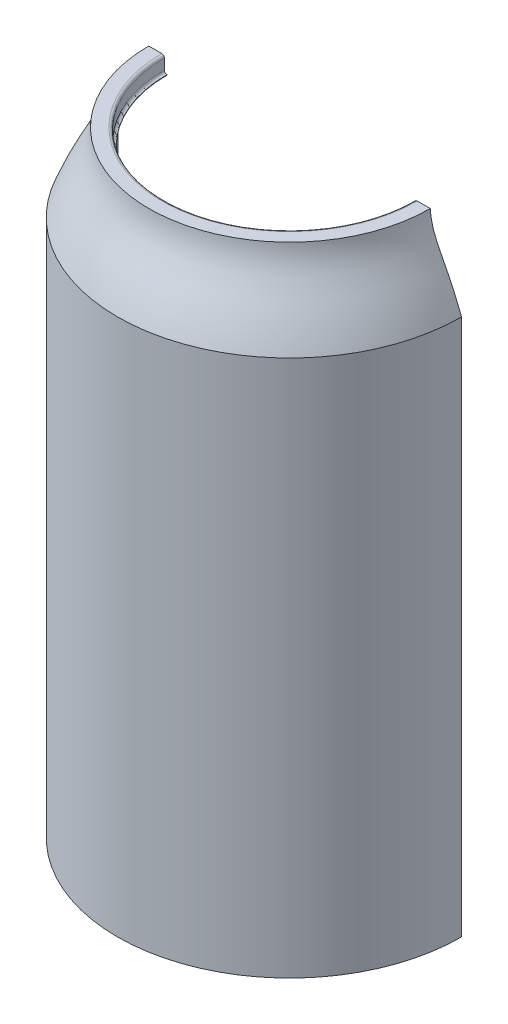
ISO-10303-21;
HEADER;
FILE_DESCRIPTION(('STEP AP214'),'2;1');
FILE_NAME('part.step','',(''),(''),'','','');
FILE_SCHEMA(('AUTOMOTIVE_DESIGN { 1 0 10303 214 1 1 1 1 }'));
ENDSEC;
DATA;
#1=APPLICATION_CONTEXT('core data for automotive mechanical design processes');
#2=APPLICATION_PROTOCOL_DEFINITION('international standard','automotive_design',2000,#1);
#3=PRODUCT_CONTEXT('',#1,'mechanical');
#4=PRODUCT('Part','Part','',(#3));
#5=PRODUCT_RELATED_PRODUCT_CATEGORY('part','',(#4));
#6=PRODUCT_DEFINITION_FORMATION('','',#4);
#7=PRODUCT_DEFINITION_CONTEXT('part definition',#1,'design');
#8=PRODUCT_DEFINITION('design','',#6,#7);
#9=PRODUCT_DEFINITION_SHAPE('','',#8);
#10=(LENGTH_UNIT() NAMED_UNIT(*) SI_UNIT(.MILLI.,.METRE.));
#11=(NAMED_UNIT(*) PLANE_ANGLE_UNIT() SI_UNIT($,.RADIAN.));
#12=(NAMED_UNIT(*) SI_UNIT($,.STERADIAN.) SOLID_ANGLE_UNIT());
#13=UNCERTAINTY_MEASURE_WITH_UNIT(LENGTH_MEASURE(1.E-05),#10,'distance_accuracy_value','');
#14=(GEOMETRIC_REPRESENTATION_CONTEXT(3) GLOBAL_UNCERTAINTY_ASSIGNED_CONTEXT((#13)) GLOBAL_UNIT_ASSIGNED_CONTEXT((#10,
#11,#12)) REPRESENTATION_CONTEXT('',''));
#15=CARTESIAN_POINT('',(0.,0.,0.));
#16=DIRECTION('',(0.,0.,1.));
#17=DIRECTION('',(1.,0.,0.));
#18=AXIS2_PLACEMENT_3D('',#15,#16,#17);
#19=CARTESIAN_POINT('',(33.,-51.5,0.));
#20=CARTESIAN_POINT('',(27.2132128879075,-53.4506224738682,0.));
#21=CARTESIAN_POINT('',(25.5,-56.5,0.));
#22=B_SPLINE_CURVE_WITH_KNOTS('',2,(#19,#20,#21),.UNSPECIFIED.,.F.,.F.,(3,3),(0.,
0.724920870834953),.UNSPECIFIED.);
#23=CARTESIAN_POINT('',(0.,66.5,0.));
#24=DIRECTION('',(0.,1.,0.));
#25=AXIS1_PLACEMENT('',#23,#24);
#26=SURFACE_OF_REVOLUTION('',#22,#25);
#27=CARTESIAN_POINT('',(33.,-51.5,0.));
#28=CARTESIAN_POINT('',(27.2132128879075,-53.4506224738682,0.));
#29=CARTESIAN_POINT('',(25.5,-56.5,0.));
#30=B_SPLINE_CURVE_WITH_KNOTS('',2,(#27,#28,#29),.UNSPECIFIED.,.F.,.F.,(3,3),(0.,
0.724920870834953),.UNSPECIFIED.);
#31=CARTESIAN_POINT('',(33.,-51.5,0.));
#32=VERTEX_POINT('',#31);
#33=CARTESIAN_POINT('',(25.5,-56.5,0.));
#34=VERTEX_POINT('',#33);
#35=EDGE_CURVE('E344',#32,#34,#30,.T.);
#36=ORIENTED_EDGE('',*,*,#35,.F.);
#37=CARTESIAN_POINT('',(0.,-51.5,0.));
#38=DIRECTION('',(0.,1.,0.));
#39=DIRECTION('',(-1.,0.,0.));
#40=AXIS2_PLACEMENT_3D('',#37,#38,#39);
#41=CIRCLE('',#40,33.);
#42=CARTESIAN_POINT('',(-33.,-51.5,0.));
#43=VERTEX_POINT('',#42);
#44=EDGE_CURVE('E171',#43,#32,#41,.T.);
#45=ORIENTED_EDGE('',*,*,#44,.F.);
#46=CARTESIAN_POINT('',(-33.,-51.5,0.));
#47=CARTESIAN_POINT('',(-27.2132128879075,-53.4506224738682,0.));
#48=CARTESIAN_POINT('',(-25.5,-56.5,0.));
#49=B_SPLINE_CURVE_WITH_KNOTS('',2,(#46,#47,#48),.UNSPECIFIED.,.F.,.F.,(3,3),(0.,
0.724920870834953),.UNSPECIFIED.);
#50=CARTESIAN_POINT('',(-25.5,-56.5,0.));
#51=VERTEX_POINT('',#50);
#52=EDGE_CURVE('E192',#51,#43,#49,.F.);
#53=ORIENTED_EDGE('',*,*,#52,.F.);
#54=CARTESIAN_POINT('',(0.,-56.5,0.));
#55=DIRECTION('',(0.,1.,0.));
#56=DIRECTION('',(-1.,0.,0.));
#57=AXIS2_PLACEMENT_3D('',#54,#55,#56);
#58=CIRCLE('',#57,25.5);
#59=EDGE_CURVE('E224',#51,#34,#58,.T.);
#60=ORIENTED_EDGE('',*,*,#59,.T.);
#61=EDGE_LOOP('',(#36,#45,#53,#60));
#62=FACE_BOUND('',#61,.T.);
#63=ADVANCED_FACE('F41',(#62),#26,.F.);
#64=CARTESIAN_POINT('',(0.,66.5,0.));
#65=DIRECTION('',(0.,1.,0.));
#66=DIRECTION('',(-1.,0.,0.));
#67=AXIS2_PLACEMENT_3D('',#64,#65,#66);
#68=CYLINDRICAL_SURFACE('',#67,33.);
#69=ORIENTED_EDGE('',*,*,#44,.T.);
#70=DIRECTION('',(0.,1.,0.));
#71=VECTOR('',#70,1.);
#72=CARTESIAN_POINT('',(33.,66.5,0.));
#73=LINE('',#72,#71);
#74=CARTESIAN_POINT('',(33.,51.5,0.));
#75=VERTEX_POINT('',#74);
#76=EDGE_CURVE('E340',#32,#75,#73,.T.);
#77=ORIENTED_EDGE('',*,*,#76,.T.);
#78=CARTESIAN_POINT('',(0.,51.5,0.));
#79=DIRECTION('',(0.,1.,0.));
#80=DIRECTION('',(-1.,0.,0.));
#81=AXIS2_PLACEMENT_3D('',#78,#79,#80);
#82=CIRCLE('',#81,33.);
#83=CARTESIAN_POINT('',(-33.,51.5,0.));
#84=VERTEX_POINT('',#83);
#85=EDGE_CURVE('E409',#84,#75,#82,.T.);
#86=ORIENTED_EDGE('',*,*,#85,.F.);
#87=DIRECTION('',(0.,1.,0.));
#88=VECTOR('',#87,1.);
#89=CARTESIAN_POINT('',(-33.,66.5,0.));
#90=LINE('',#89,#88);
#91=EDGE_CURVE('E377',#84,#43,#90,.F.);
#92=ORIENTED_EDGE('',*,*,#91,.T.);
#93=EDGE_LOOP('',(#69,#77,#86,#92));
#94=FACE_BOUND('',#93,.T.);
#95=ADVANCED_FACE('F43',(#94),#68,.T.);
#96=CARTESIAN_POINT('',(33.,51.5,0.));
#97=CARTESIAN_POINT('',(29.8692891987023,59.7715027618843,0.));
#98=CARTESIAN_POINT('',(27.3334411414249,61.459674459782,0.));
#99=CARTESIAN_POINT('',(27.,66.5,0.));
#100=B_SPLINE_CURVE_WITH_KNOTS('',3,(#96,#97,#98,#99),.UNSPECIFIED.,.F.,.F.,(4,4),(0.,
0.746651366768244),.UNSPECIFIED.);
#101=CARTESIAN_POINT('',(0.,66.5,0.));
#102=DIRECTION('',(0.,1.,0.));
#103=AXIS1_PLACEMENT('',#101,#102);
#104=SURFACE_OF_REVOLUTION('',#100,#103);
#105=ORIENTED_EDGE('',*,*,#85,.T.);
#106=CARTESIAN_POINT('',(33.,51.5,0.));
#107=CARTESIAN_POINT('',(29.8692891987023,59.7715027618843,0.));
#108=CARTESIAN_POINT('',(27.3334411414249,61.459674459782,0.));
#109=CARTESIAN_POINT('',(27.,66.5,0.));
#110=B_SPLINE_CURVE_WITH_KNOTS('',3,(#106,#107,#108,#109),.UNSPECIFIED.,.F.,.F.,(4,4),(0.,
0.746651366768244),.UNSPECIFIED.);
#111=CARTESIAN_POINT('',(27.,66.5,0.));
#112=VERTEX_POINT('',#111);
#113=EDGE_CURVE('E335',#75,#112,#110,.T.);
#114=ORIENTED_EDGE('',*,*,#113,.T.);
#115=CARTESIAN_POINT('',(0.,66.5,0.));
#116=DIRECTION('',(0.,1.,0.));
#117=DIRECTION('',(-1.,0.,0.));
#118=AXIS2_PLACEMENT_3D('',#115,#116,#117);
#119=CIRCLE('',#118,27.);
#120=CARTESIAN_POINT('',(-27.,66.5,0.));
#121=VERTEX_POINT('',#120);
#122=EDGE_CURVE('E413',#121,#112,#119,.T.);
#123=ORIENTED_EDGE('',*,*,#122,.F.);
#124=CARTESIAN_POINT('',(-33.,51.5,0.));
#125=CARTESIAN_POINT('',(-29.8692891987023,59.7715027618843,0.));
#126=CARTESIAN_POINT('',(-27.3334411414249,61.459674459782,0.));
#127=CARTESIAN_POINT('',(-27.,66.5,0.));
#128=B_SPLINE_CURVE_WITH_KNOTS('',3,(#124,#125,#126,#127),.UNSPECIFIED.,.F.,.F.,(4,4),(0.,
0.746651366768244),.UNSPECIFIED.);
#129=EDGE_CURVE('E374',#121,#84,#128,.F.);
#130=ORIENTED_EDGE('',*,*,#129,.T.);
#131=EDGE_LOOP('',(#105,#114,#123,#130));
#132=FACE_BOUND('',#131,.T.);
#133=ADVANCED_FACE('F254',(#132),#104,.T.);
#134=CARTESIAN_POINT('',(0.,66.5,0.));
#135=DIRECTION('',(0.,-1.,0.));
#136=DIRECTION('',(1.,0.,0.));
#137=AXIS2_PLACEMENT_3D('',#134,#135,#136);
#138=PLANE('',#137);
#139=ORIENTED_EDGE('',*,*,#122,.T.);
#140=DIRECTION('',(-1.,0.,0.));
#141=VECTOR('',#140,1.);
#142=CARTESIAN_POINT('',(0.,66.5,0.));
#143=LINE('',#142,#141);
#144=CARTESIAN_POINT('',(24.5,66.5,0.));
#145=VERTEX_POINT('',#144);
#146=EDGE_CURVE('E331',#112,#145,#143,.T.);
#147=ORIENTED_EDGE('',*,*,#146,.T.);
#148=CARTESIAN_POINT('',(0.,66.5,0.));
#149=DIRECTION('',(0.,1.,0.));
#150=DIRECTION('',(-1.,0.,0.));
#151=AXIS2_PLACEMENT_3D('',#148,#149,#150);
#152=CIRCLE('',#151,24.5);
#153=CARTESIAN_POINT('',(-24.5,66.5,0.));
#154=VERTEX_POINT('',#153);
#155=EDGE_CURVE('E419',#154,#145,#152,.T.);
#156=ORIENTED_EDGE('',*,*,#155,.F.);
#157=EDGE_CURVE('E337',#154,#121,#143,.T.);
#158=ORIENTED_EDGE('',*,*,#157,.T.);
#159=EDGE_LOOP('',(#139,#147,#156,#158));
#160=FACE_BOUND('',#159,.T.);
#161=ADVANCED_FACE('F458',(#160),#138,.F.);
#162=CARTESIAN_POINT('',(0.,66.,0.));
#163=DIRECTION('',(0.,1.,0.));
#164=DIRECTION('',(-1.,0.,0.));
#165=AXIS2_PLACEMENT_3D('',#162,#163,#164);
#166=TOROIDAL_SURFACE('',#165,24.5,0.5);
#167=ORIENTED_EDGE('',*,*,#155,.T.);
#168=CARTESIAN_POINT('',(24.5,66.,0.));
#169=DIRECTION('',(0.,0.,1.));
#170=DIRECTION('',(1.,0.,0.));
#171=AXIS2_PLACEMENT_3D('',#168,#169,#170);
#172=CIRCLE('',#171,0.5);
#173=CARTESIAN_POINT('',(24.,66.,0.));
#174=VERTEX_POINT('',#173);
#175=EDGE_CURVE('E327',#145,#174,#172,.T.);
#176=ORIENTED_EDGE('',*,*,#175,.T.);
#177=CARTESIAN_POINT('',(0.,66.,0.));
#178=DIRECTION('',(0.,1.,0.));
#179=DIRECTION('',(-1.,0.,0.));
#180=AXIS2_PLACEMENT_3D('',#177,#178,#179);
#181=CIRCLE('',#180,24.);
#182=CARTESIAN_POINT('',(-24.,66.,0.));
#183=VERTEX_POINT('',#182);
#184=EDGE_CURVE('E423',#183,#174,#181,.T.);
#185=ORIENTED_EDGE('',*,*,#184,.F.);
#186=CARTESIAN_POINT('',(-24.5,66.,0.));
#187=DIRECTION('',(0.,0.,1.));
#188=DIRECTION('',(1.,0.,0.));
#189=AXIS2_PLACEMENT_3D('',#186,#187,#188);
#190=CIRCLE('',#189,0.5);
#191=EDGE_CURVE('E367',#183,#154,#190,.T.);
#192=ORIENTED_EDGE('',*,*,#191,.T.);
#193=EDGE_LOOP('',(#167,#176,#185,#192));
#194=FACE_BOUND('',#193,.T.);
#195=ADVANCED_FACE('F455',(#194),#166,.T.);
#196=CARTESIAN_POINT('',(0.,66.5,0.));
#197=DIRECTION('',(0.,1.,0.));
#198=DIRECTION('',(-1.,0.,0.));
#199=AXIS2_PLACEMENT_3D('',#196,#197,#198);
#200=CYLINDRICAL_SURFACE('',#199,24.);
#201=DIRECTION('',(0.,1.,0.));
#202=VECTOR('',#201,1.);
#203=CARTESIAN_POINT('',(24.,66.5,0.));
#204=LINE('',#203,#202);
#205=CARTESIAN_POINT('',(24.,64.,0.));
#206=VERTEX_POINT('',#205);
#207=EDGE_CURVE('E324',#206,#174,#204,.T.);
#208=ORIENTED_EDGE('',*,*,#207,.F.);
#209=CARTESIAN_POINT('',(0.,64.,0.));
#210=DIRECTION('',(0.,1.,0.));
#211=DIRECTION('',(-1.,0.,0.));
#212=AXIS2_PLACEMENT_3D('',#209,#210,#211);
#213=CIRCLE('',#212,24.);
#214=CARTESIAN_POINT('',(-24.,64.,0.));
#215=VERTEX_POINT('',#214);
#216=EDGE_CURVE('E427',#215,#206,#213,.T.);
#217=ORIENTED_EDGE('',*,*,#216,.F.);
#218=DIRECTION('',(0.,1.,0.));
#219=VECTOR('',#218,1.);
#220=CARTESIAN_POINT('',(-24.,66.5,0.));
#221=LINE('',#220,#219);
#222=EDGE_CURVE('E364',#183,#215,#221,.F.);
#223=ORIENTED_EDGE('',*,*,#222,.F.);
#224=ORIENTED_EDGE('',*,*,#184,.T.);
#225=EDGE_LOOP('',(#208,#217,#223,#224));
#226=FACE_BOUND('',#225,.T.);
#227=ADVANCED_FACE('F448',(#226),#200,.F.);
#228=CARTESIAN_POINT('',(0.,64.,0.));
#229=DIRECTION('',(0.,1.,0.));
#230=DIRECTION('',(-1.,0.,0.));
#231=AXIS2_PLACEMENT_3D('',#228,#229,#230);
#232=TOROIDAL_SURFACE('',#231,23.5,0.5);
#233=ORIENTED_EDGE('',*,*,#216,.T.);
#234=CARTESIAN_POINT('',(23.5,64.,0.));
#235=DIRECTION('',(0.,0.,1.));
#236=DIRECTION('',(1.,0.,0.));
#237=AXIS2_PLACEMENT_3D('',#234,#235,#236);
#238=CIRCLE('',#237,0.5);
#239=CARTESIAN_POINT('',(23.5,63.5,0.));
#240=VERTEX_POINT('',#239);
#241=EDGE_CURVE('E320',#206,#240,#238,.F.);
#242=ORIENTED_EDGE('',*,*,#241,.T.);
#243=CARTESIAN_POINT('',(0.,63.5,0.));
#244=DIRECTION('',(0.,1.,0.));
#245=DIRECTION('',(-1.,0.,0.));
#246=AXIS2_PLACEMENT_3D('',#243,#244,#245);
#247=CIRCLE('',#246,23.5);
#248=CARTESIAN_POINT('',(-23.5,63.5,0.));
#249=VERTEX_POINT('',#248);
#250=EDGE_CURVE('E190',#249,#240,#247,.T.);
#251=ORIENTED_EDGE('',*,*,#250,.F.);
#252=CARTESIAN_POINT('',(-23.5,64.,0.));
#253=DIRECTION('',(0.,0.,1.));
#254=DIRECTION('',(1.,0.,0.));
#255=AXIS2_PLACEMENT_3D('',#252,#253,#254);
#256=CIRCLE('',#255,0.5);
#257=EDGE_CURVE('E360',#249,#215,#256,.F.);
#258=ORIENTED_EDGE('',*,*,#257,.T.);
#259=EDGE_LOOP('',(#233,#242,#251,#258));
#260=FACE_BOUND('',#259,.T.);
#261=ADVANCED_FACE('F441',(#260),#232,.F.);
#262=CARTESIAN_POINT('',(0.,-82.75,0.));
#263=DIRECTION('',(0.,1.,0.));
#264=DIRECTION('',(1.,0.,0.));
#265=AXIS2_PLACEMENT_3D('',#262,#263,#264);
#266=SPHERICAL_SURFACE('',#265,36.25);
#267=CARTESIAN_POINT('',(0.,-56.5,0.));
#268=DIRECTION('',(0.,1.,0.));
#269=DIRECTION('',(-1.,0.,0.));
#270=AXIS2_PLACEMENT_3D('',#267,#268,#269);
#271=CIRCLE('',#270,25.);
#272=CARTESIAN_POINT('',(-25.,-56.5,0.));
#273=VERTEX_POINT('',#272);
#274=CARTESIAN_POINT('',(25.,-56.5,0.));
#275=VERTEX_POINT('',#274);
#276=EDGE_CURVE('E431',#273,#275,#271,.T.);
#277=ORIENTED_EDGE('',*,*,#276,.F.);
#278=CARTESIAN_POINT('',(0.,-82.75,0.));
#279=DIRECTION('',(0.,0.,1.));
#280=DIRECTION('',(1.,0.,0.));
#281=AXIS2_PLACEMENT_3D('',#278,#279,#280);
#282=CIRCLE('',#281,36.25);
#283=EDGE_CURVE('E357',#273,#275,#282,.F.);
#284=ORIENTED_EDGE('',*,*,#283,.T.);
#285=EDGE_LOOP('',(#277,#284));
#286=FACE_BOUND('',#285,.T.);
#287=ADVANCED_FACE('F439',(#286),#266,.F.);
#288=CARTESIAN_POINT('',(1.56819002228305E-12,-56.5,0.));
#289=DIRECTION('',(0.,1.,0.));
#290=DIRECTION('',(-1.,0.,0.));
#291=AXIS2_PLACEMENT_3D('',#288,#289,#290);
#292=PLANE('',#291);
#293=ORIENTED_EDGE('',*,*,#59,.F.);
#294=DIRECTION('',(1.,0.,0.));
#295=VECTOR('',#294,1.);
#296=CARTESIAN_POINT('',(1.56819002228305E-12,-56.5,0.));
#297=LINE('',#296,#295);
#298=EDGE_CURVE('E63',#51,#273,#297,.T.);
#299=ORIENTED_EDGE('',*,*,#298,.T.);
#300=ORIENTED_EDGE('',*,*,#276,.T.);
#301=EDGE_CURVE('E194',#275,#34,#297,.T.);
#302=ORIENTED_EDGE('',*,*,#301,.T.);
#303=EDGE_LOOP('',(#293,#299,#300,#302));
#304=FACE_BOUND('',#303,.T.);
#305=ADVANCED_FACE('F436',(#304),#292,.F.);
#306=CARTESIAN_POINT('',(0.,63.5,0.));
#307=DIRECTION('',(0.,1.,0.));
#308=DIRECTION('',(-1.,0.,0.));
#309=AXIS2_PLACEMENT_3D('',#306,#307,#308);
#310=CYLINDRICAL_SURFACE('',#309,23.5);
#311=ORIENTED_EDGE('',*,*,#250,.T.);
#312=DIRECTION('',(0.,1.,0.));
#313=VECTOR('',#312,1.);
#314=CARTESIAN_POINT('',(23.5,63.5,0.));
#315=LINE('',#314,#313);
#316=CARTESIAN_POINT('',(23.5,63.4,0.));
#317=VERTEX_POINT('',#316);
#318=EDGE_CURVE('E316',#240,#317,#315,.F.);
#319=ORIENTED_EDGE('',*,*,#318,.T.);
#320=CARTESIAN_POINT('',(0.,63.4,0.));
#321=DIRECTION('',(0.,1.,0.));
#322=DIRECTION('',(-1.,0.,0.));
#323=AXIS2_PLACEMENT_3D('',#320,#321,#322);
#324=CIRCLE('',#323,23.5);
#325=CARTESIAN_POINT('',(-23.5,63.4,0.));
#326=VERTEX_POINT('',#325);
#327=EDGE_CURVE('E200',#326,#317,#324,.T.);
#328=ORIENTED_EDGE('',*,*,#327,.F.);
#329=DIRECTION('',(0.,1.,0.));
#330=VECTOR('',#329,1.);
#331=CARTESIAN_POINT('',(-23.5,63.5,0.));
#332=LINE('',#331,#330);
#333=EDGE_CURVE('E350',#326,#249,#332,.T.);
#334=ORIENTED_EDGE('',*,*,#333,.T.);
#335=EDGE_LOOP('',(#311,#319,#328,#334));
#336=FACE_BOUND('',#335,.T.);
#337=ADVANCED_FACE('F278',(#336),#310,.F.);
#338=CARTESIAN_POINT('',(33.,-51.5,0.));
#339=CARTESIAN_POINT('',(27.2132128879075,-53.4506224738682,0.));
#340=CARTESIAN_POINT('',(25.5,-56.5,0.));
#341=B_SPLINE_CURVE_WITH_KNOTS('',2,(#338,#339,#340),.UNSPECIFIED.,.F.,.F.,(3,3),(0.,
0.724920870834953),.UNSPECIFIED.);
#342=CARTESIAN_POINT('',(0.,66.5,0.));
#343=DIRECTION('',(0.,1.,0.));
#344=AXIS1_PLACEMENT('',#342,#343);
#345=SURFACE_OF_REVOLUTION('',#341,#344);
#346=OFFSET_SURFACE('',#345,0.1,.F.);
#347=CARTESIAN_POINT('',(0.,-51.4282653719846,0.));
#348=DIRECTION('',(0.,1.,0.));
#349=DIRECTION('',(-1.,0.,0.));
#350=AXIS2_PLACEMENT_3D('',#347,#348,#349);
#351=CIRCLE('',#350,32.9);
#352=CARTESIAN_POINT('',(-32.9,-51.4282653719846,0.));
#353=VERTEX_POINT('',#352);
#354=CARTESIAN_POINT('',(32.9,-51.4282653719846,0.));
#355=VERTEX_POINT('',#354);
#356=EDGE_CURVE('E179',#353,#355,#351,.T.);
#357=ORIENTED_EDGE('',*,*,#356,.T.);
#358=CARTESIAN_POINT('',(32.9680576872527,-51.4052387808418,0.));
#359=CARTESIAN_POINT('',(32.5014327891604,-51.5627295035221,0.));
#360=CARTESIAN_POINT('',(32.0381541690806,-51.7306688221585,0.));
#361=CARTESIAN_POINT('',(31.363427802333,-51.9975713173949,0.));
#362=CARTESIAN_POINT('',(31.147875636213,-52.0862686404719,0.));
#363=CARTESIAN_POINT('',(30.7274016387538,-52.2668070907657,0.));
#364=CARTESIAN_POINT('',(30.522379755925,-52.3584138279177,0.));
#365=CARTESIAN_POINT('',(30.1229900720185,-52.5447989520354,0.));
#366=CARTESIAN_POINT('',(29.9285089890946,-52.6393340414487,0.));
#367=CARTESIAN_POINT('',(29.5502085032586,-52.8315928243068,0.));
#368=CARTESIAN_POINT('',(29.3662620923653,-52.9290658094883,0.));
#369=CARTESIAN_POINT('',(29.0090453972834,-53.1272203928476,0.));
#370=CARTESIAN_POINT('',(28.8356332038997,-53.2276453718888,0.));
#371=CARTESIAN_POINT('',(28.4995007133861,-53.4317229073358,0.));
#372=CARTESIAN_POINT('',(28.3366229105018,-53.5351151863216,0.));
#373=CARTESIAN_POINT('',(28.0215784718758,-53.745144871746,0.));
#374=CARTESIAN_POINT('',(27.8692384240833,-53.8515213067875,0.));
#375=CARTESIAN_POINT('',(27.5752905761709,-54.0675356615992,0.));
#376=CARTESIAN_POINT('',(27.4334939145207,-54.1769156340637,0.));
#377=CARTESIAN_POINT('',(27.1606611862312,-54.3989451438025,0.));
#378=CARTESIAN_POINT('',(27.0294220689847,-54.5113444944438,0.));
#379=CARTESIAN_POINT('',(26.777720691136,-54.7394306617055,0.));
#380=CARTESIAN_POINT('',(26.6570444404953,-54.8548798400478,0.));
#381=CARTESIAN_POINT('',(26.4827975972029,-55.0318749489362,0.));
#382=CARTESIAN_POINT('',(26.4265034521438,-55.0907550449802,0.));
#383=CARTESIAN_POINT('',(26.3165939735962,-55.2093042850159,0.));
#384=CARTESIAN_POINT('',(26.262950836164,-55.2689475841041,0.));
#385=CARTESIAN_POINT('',(26.1583485503418,-55.3890206981579,0.));
#386=CARTESIAN_POINT('',(26.1073616575499,-55.4494263328563,0.));
#387=CARTESIAN_POINT('',(26.0080747036048,-55.5710234663054,0.));
#388=CARTESIAN_POINT('',(25.9597472557321,-55.6321925812014,0.));
#389=CARTESIAN_POINT('',(25.8657826798362,-55.7553148440374,0.));
#390=CARTESIAN_POINT('',(25.8201188060883,-55.8172475628866,0.));
#391=CARTESIAN_POINT('',(25.7314845618601,-55.9418944705591,0.));
#392=CARTESIAN_POINT('',(25.6884884086524,-56.0045903118552,0.));
#393=CARTESIAN_POINT('',(25.6051929201595,-56.1307610986131,0.));
#394=CARTESIAN_POINT('',(25.5648691024742,-56.1942198631393,0.));
#395=CARTESIAN_POINT('',(25.4869204292584,-56.3219100734228,0.));
#396=CARTESIAN_POINT('',(25.4492727569296,-56.3861275974303,0.));
#397=CARTESIAN_POINT('',(25.4128172674341,-56.4510186653678,0.));
#398=B_SPLINE_CURVE_WITH_KNOTS('',3,(#358,#359,#360,#361,#362,#363,#364,#365,#366,#367,#368,
#369,#370,#371,#372,#373,#374,#375,#376,#377,#378,#379,#380,#381,#382,#383,#384,#385,#386,#387,
#388,#389,#390,#391,#392,#393,#394,#395,#396,#397),.UNSPECIFIED.,.F.,.F.,(4,2,2,2,2,2,2,2,2,2,2,
2,2,2,2,2,2,2,2,4),(0.,1.47746031464141,2.17664570504585,2.85020381954878,3.49880395973076,
4.12319563611324,4.7242186725435,5.30281410256988,5.86003563005673,6.39706126930244,
6.91520457695174,7.41592464888245,7.66027613766869,7.90089006471846,8.13799259243579,
8.37181969630448,8.60261699695629,8.83063948441673,9.05615112727953,9.27942436256035),.UNSPECIFIED.);
#399=CARTESIAN_POINT('',(25.4418046147181,-56.4,0.));
#400=VERTEX_POINT('',#399);
#401=EDGE_CURVE('E164',#355,#400,#398,.T.);
#402=ORIENTED_EDGE('',*,*,#401,.T.);
#403=CARTESIAN_POINT('',(0.,-56.4,0.));
#404=DIRECTION('',(0.,1.,0.));
#405=DIRECTION('',(-1.,0.,0.));
#406=AXIS2_PLACEMENT_3D('',#403,#404,#405);
#407=CIRCLE('',#406,25.4418046147181);
#408=CARTESIAN_POINT('',(-25.4418046147181,-56.4,0.));
#409=VERTEX_POINT('',#408);
#410=EDGE_CURVE('E177',#409,#400,#407,.T.);
#411=ORIENTED_EDGE('',*,*,#410,.F.);
#412=CARTESIAN_POINT('',(-25.4418046147181,-56.4,0.));
#413=CARTESIAN_POINT('',(-25.5272963845508,-56.2511418041775,0.));
#414=CARTESIAN_POINT('',(-25.6190432542682,-56.1059898031729,0.));
#415=CARTESIAN_POINT('',(-25.8131536213326,-55.8238565578844,0.));
#416=CARTESIAN_POINT('',(-25.9154704142514,-55.6868432543893,0.));
#417=CARTESIAN_POINT('',(-26.1294542138798,-55.4206337091428,0.));
#418=CARTESIAN_POINT('',(-26.2411102820985,-55.2914286195075,0.));
#419=CARTESIAN_POINT('',(-26.47058384896,-55.0425959014808,0.));
#420=CARTESIAN_POINT('',(-26.5882678503851,-54.9228446505064,0.));
#421=CARTESIAN_POINT('',(-26.8304198826455,-54.6901872228273,0.));
#422=CARTESIAN_POINT('',(-26.954894555019,-54.5772879841143,0.));
#423=CARTESIAN_POINT('',(-27.209560805273,-54.3580495980422,0.));
#424=CARTESIAN_POINT('',(-27.3397548566952,-54.2517133378452,0.));
#425=CARTESIAN_POINT('',(-27.6761510964633,-53.9897922614784,0.));
#426=CARTESIAN_POINT('',(-27.8856349774583,-53.8384156349594,0.));
#427=CARTESIAN_POINT('',(-28.3134216117683,-53.5487395206759,0.));
#428=CARTESIAN_POINT('',(-28.5317258341916,-53.4104422243147,0.));
#429=CARTESIAN_POINT('',(-28.9752885714783,-53.1454405879035,0.));
#430=CARTESIAN_POINT('',(-29.2005485249096,-53.0187386677514,0.));
#431=CARTESIAN_POINT('',(-29.6585047017162,-52.7745934540413,0.));
#432=CARTESIAN_POINT('',(-29.8912483637672,-52.6572396289944,0.));
#433=CARTESIAN_POINT('',(-30.3611032085722,-52.4318678851751,0.));
#434=CARTESIAN_POINT('',(-30.5982130117831,-52.3238470768875,0.));
#435=CARTESIAN_POINT('',(-31.0759805555241,-52.1160933784304,0.));
#436=CARTESIAN_POINT('',(-31.3166377598705,-52.0163592505648,0.));
#437=CARTESIAN_POINT('',(-31.7809282664379,-51.8321876014778,0.));
#438=CARTESIAN_POINT('',(-32.0043313802075,-51.7471667581561,0.));
#439=CARTESIAN_POINT('',(-32.4515554422906,-51.5833790828112,0.));
#440=CARTESIAN_POINT('',(-32.6753611846292,-51.5045707876171,0.));
#441=CARTESIAN_POINT('',(-32.9,-51.4282653719846,0.));
#442=B_SPLINE_CURVE_WITH_KNOTS('',3,(#412,#413,#414,#415,#416,#417,#418,#419,#420,#421,#422,
#423,#424,#425,#426,#427,#428,#429,#430,#431,#432,#433,#434,#435,#436,#437,#438,#439,#440,#441),
.UNSPECIFIED.,.F.,.F.,(4,2,2,2,2,2,2,2,2,2,2,2,2,2,4),(0.,0.514687560367349,1.02719101443867,
1.53910239332765,2.04249273671031,2.54638456365289,3.05049650369203,3.82524345666918,
4.60011998710711,5.37515786342759,6.15689313188533,6.93838550018565,7.71976093440258,
8.43678718024142,9.14853049452551),.UNSPECIFIED.);
#443=EDGE_CURVE('E280',#409,#353,#442,.T.);
#444=ORIENTED_EDGE('',*,*,#443,.T.);
#445=EDGE_LOOP('',(#357,#402,#411,#444));
#446=FACE_BOUND('',#445,.T.);
#447=ADVANCED_FACE('F175',(#446),#346,.T.);
#448=CARTESIAN_POINT('',(0.,66.5,0.));
#449=DIRECTION('',(0.,1.,0.));
#450=DIRECTION('',(-1.,0.,0.));
#451=AXIS2_PLACEMENT_3D('',#448,#449,#450);
#452=CYLINDRICAL_SURFACE('',#451,32.9);
#453=DIRECTION('',(0.,1.,0.));
#454=VECTOR('',#453,1.);
#455=CARTESIAN_POINT('',(32.9,66.5,0.));
#456=LINE('',#455,#454);
#457=CARTESIAN_POINT('',(32.9,51.481701346526,0.));
#458=VERTEX_POINT('',#457);
#459=EDGE_CURVE('E181',#355,#458,#456,.T.);
#460=ORIENTED_EDGE('',*,*,#459,.F.);
#461=ORIENTED_EDGE('',*,*,#356,.F.);
#462=DIRECTION('',(0.,1.,0.));
#463=VECTOR('',#462,1.);
#464=CARTESIAN_POINT('',(-32.9,66.5,0.));
#465=LINE('',#464,#463);
#466=CARTESIAN_POINT('',(-32.9,51.481701346526,0.));
#467=VERTEX_POINT('',#466);
#468=EDGE_CURVE('E298',#467,#353,#465,.F.);
#469=ORIENTED_EDGE('',*,*,#468,.F.);
#470=CARTESIAN_POINT('',(0.,51.481701346526,0.));
#471=DIRECTION('',(0.,1.,0.));
#472=DIRECTION('',(-1.,0.,0.));
#473=AXIS2_PLACEMENT_3D('',#470,#471,#472);
#474=CIRCLE('',#473,32.9);
#475=EDGE_CURVE('E201',#467,#458,#474,.T.);
#476=ORIENTED_EDGE('',*,*,#475,.T.);
#477=EDGE_LOOP('',(#460,#461,#469,#476));
#478=FACE_BOUND('',#477,.T.);
#479=ADVANCED_FACE('F244',(#478),#452,.F.);
#480=CARTESIAN_POINT('',(33.,51.5,0.));
#481=CARTESIAN_POINT('',(29.8692891987023,59.7715027618843,0.));
#482=CARTESIAN_POINT('',(27.3334411414249,61.459674459782,0.));
#483=CARTESIAN_POINT('',(27.,66.5,0.));
#484=B_SPLINE_CURVE_WITH_KNOTS('',3,(#480,#481,#482,#483),.UNSPECIFIED.,.F.,.F.,(4,4),(0.,
0.746651366768244),.UNSPECIFIED.);
#485=CARTESIAN_POINT('',(0.,66.5,0.));
#486=DIRECTION('',(0.,1.,0.));
#487=AXIS1_PLACEMENT('',#485,#486);
#488=SURFACE_OF_REVOLUTION('',#484,#487);
#489=OFFSET_SURFACE('',#488,-0.1,.F.);
#490=CARTESIAN_POINT('',(32.9064749413078,51.4646013644806,0.));
#491=CARTESIAN_POINT('',(32.7196957927199,51.9582540038963,0.));
#492=CARTESIAN_POINT('',(32.5268856828011,52.4496473232299,0.));
#493=CARTESIAN_POINT('',(32.1456475982872,53.3854319201175,0.));
#494=CARTESIAN_POINT('',(31.958256984666,53.8302463681903,0.));
#495=CARTESIAN_POINT('',(31.5886941837369,54.6777620749083,0.));
#496=CARTESIAN_POINT('',(31.407414064132,55.0808520425317,0.));
#497=CARTESIAN_POINT('',(31.0510198475264,55.8498540458003,0.));
#498=CARTESIAN_POINT('',(30.87662330108,56.2160990875903,0.));
#499=CARTESIAN_POINT('',(30.5349350101167,56.9163715612844,0.));
#500=CARTESIAN_POINT('',(30.3681713047049,57.2506573078977,0.));
#501=CARTESIAN_POINT('',(30.0427001187495,57.8920005160699,0.));
#502=CARTESIAN_POINT('',(29.8843219535919,58.1992258328176,0.));
#503=CARTESIAN_POINT('',(29.576573173868,58.7914588450524,0.));
#504=CARTESIAN_POINT('',(29.4273355620571,59.0765360943974,0.));
#505=CARTESIAN_POINT('',(29.1388140505941,59.6294928405798,0.));
#506=CARTESIAN_POINT('',(28.999484154941,59.8973481451774,0.));
#507=CARTESIAN_POINT('',(28.7317112561934,60.420868260413,0.));
#508=CARTESIAN_POINT('',(28.6030804194193,60.6764360744572,0.));
#509=CARTESIAN_POINT('',(28.3576158513418,61.1803507037455,0.));
#510=CARTESIAN_POINT('',(28.240514834934,61.428565785734,0.));
#511=CARTESIAN_POINT('',(28.0189772001799,61.9226602438097,0.));
#512=CARTESIAN_POINT('',(27.9142852904526,62.1684239522983,0.));
#513=CARTESIAN_POINT('',(27.718366436066,62.6624348947303,0.));
#514=CARTESIAN_POINT('',(27.6270129866325,62.9106311915331,0.));
#515=CARTESIAN_POINT('',(27.5009550264692,63.2871347007256,0.));
#516=CARTESIAN_POINT('',(27.4606947822682,63.4135951638156,0.));
#517=CARTESIAN_POINT('',(27.3837786939866,63.6688729729107,0.));
#518=CARTESIAN_POINT('',(27.3471591363533,63.7977012961465,0.));
#519=CARTESIAN_POINT('',(27.2776151130933,64.05829707258,0.));
#520=CARTESIAN_POINT('',(27.2447499801025,64.1900803622553,0.));
#521=CARTESIAN_POINT('',(27.1827947132509,64.4571707826299,0.));
#522=CARTESIAN_POINT('',(27.1537881413425,64.5924973006142,0.));
#523=CARTESIAN_POINT('',(27.099628830129,64.8672593764024,0.));
#524=CARTESIAN_POINT('',(27.0745840091814,65.0067161787342,0.));
#525=CARTESIAN_POINT('',(27.0284238537763,65.2903273894328,0.));
#526=CARTESIAN_POINT('',(27.0074396915475,65.4345031044753,0.));
#527=CARTESIAN_POINT('',(26.9694783961749,65.7281421990306,0.));
#528=CARTESIAN_POINT('',(26.9526536545695,65.8776251431255,0.));
#529=CARTESIAN_POINT('',(26.9230796251872,66.1824808318629,0.));
#530=CARTESIAN_POINT('',(26.9105006777816,66.3378701868409,0.));
#531=CARTESIAN_POINT('',(26.9002181064716,66.4933989603934,0.));
#532=B_SPLINE_CURVE_WITH_KNOTS('',3,(#490,#491,#492,#493,#494,#495,#496,#497,#498,#499,#500,
#501,#502,#503,#504,#505,#506,#507,#508,#509,#510,#511,#512,#513,#514,#515,#516,#517,#518,#519,
#520,#521,#522,#523,#524,#525,#526,#527,#528,#529,#530,#531),.UNSPECIFIED.,.F.,.F.,(4,2,2,2,2,2,
2,2,2,2,2,2,2,2,2,2,2,2,2,2,4),(0.,1.58340845393979,3.03129469759625,4.35710812925453,
5.57396680196349,6.69463953406855,7.73156087183255,8.69689549026372,9.60266703865813,
10.4609583631423,11.284173455236,12.0853273948644,12.8783057259193,13.2763943086915,
13.6781194862881,14.0855048678155,14.5006283541741,14.9256132699062,15.3626180742757,
15.8138254185855,16.2814313153976),.UNSPECIFIED.);
#533=CARTESIAN_POINT('',(26.9066743241808,66.4000000000001,0.));
#534=VERTEX_POINT('',#533);
#535=EDGE_CURVE('E259',#458,#534,#532,.T.);
#536=ORIENTED_EDGE('',*,*,#535,.F.);
#537=ORIENTED_EDGE('',*,*,#475,.F.);
#538=CARTESIAN_POINT('',(-26.9066743241808,66.4000000000001,0.));
#539=CARTESIAN_POINT('',(-26.9224434872685,66.1807734129874,0.));
#540=CARTESIAN_POINT('',(-26.9429083285433,65.9618365513872,0.));
#541=CARTESIAN_POINT('',(-26.994072967449,65.5252549770099,0.));
#542=CARTESIAN_POINT('',(-27.0247688127431,65.307609798238,0.));
#543=CARTESIAN_POINT('',(-27.0972371151923,64.8742306738636,0.));
#544=CARTESIAN_POINT('',(-27.1390056567495,64.6584960804423,0.));
#545=CARTESIAN_POINT('',(-27.2331103271079,64.2334411971323,0.));
#546=CARTESIAN_POINT('',(-27.28524135213,64.0240755021309,0.));
#547=CARTESIAN_POINT('',(-27.4002917261166,63.6083482881026,0.));
#548=CARTESIAN_POINT('',(-27.4632104522804,63.4019865963928,0.));
#549=CARTESIAN_POINT('',(-27.5989726133529,62.9926068370768,0.));
#550=CARTESIAN_POINT('',(-27.6718146592095,62.78958830595,0.));
#551=CARTESIAN_POINT('',(-27.8642439988368,62.2872436086353,0.));
#552=CARTESIAN_POINT('',(-27.9891305314715,61.9899548440804,0.));
#553=CARTESIAN_POINT('',(-28.2523743077743,61.4014255360489,0.));
#554=CARTESIAN_POINT('',(-28.3907355669463,61.1101868270693,0.));
#555=CARTESIAN_POINT('',(-28.6758781475413,60.5302492287177,0.));
#556=CARTESIAN_POINT('',(-28.8226952359874,60.241568157725,0.));
#557=CARTESIAN_POINT('',(-29.1194987685667,59.6659116143175,0.));
#558=CARTESIAN_POINT('',(-29.2694847590355,59.3789359051973,0.));
#559=CARTESIAN_POINT('',(-29.5270403829217,58.8858832133433,0.));
#560=CARTESIAN_POINT('',(-29.6346398973922,58.6798220117565,0.));
#561=CARTESIAN_POINT('',(-29.848924990275,58.2672189275047,0.));
#562=CARTESIAN_POINT('',(-29.9556105523673,58.0606770363398,0.));
#563=CARTESIAN_POINT('',(-30.1674359492485,57.6467998848205,0.));
#564=CARTESIAN_POINT('',(-30.2725757805127,57.4394646226585,0.));
#565=CARTESIAN_POINT('',(-30.4806469295899,57.024267103869,0.));
#566=CARTESIAN_POINT('',(-30.5835826579569,56.8164070605291,0.));
#567=CARTESIAN_POINT('',(-30.7872061591237,56.3995863920275,0.));
#568=CARTESIAN_POINT('',(-30.8878939190362,56.1906257605647,0.));
#569=CARTESIAN_POINT('',(-31.0868488240385,55.7715565218422,0.));
#570=CARTESIAN_POINT('',(-31.1851159856481,55.561447922429,0.));
#571=CARTESIAN_POINT('',(-31.3794412887927,55.1394193044039,0.));
#572=CARTESIAN_POINT('',(-31.4754916112,54.9274956847156,0.));
#573=CARTESIAN_POINT('',(-31.6650340535234,54.5025055069488,0.));
#574=CARTESIAN_POINT('',(-31.7585261531365,54.2894389398155,0.));
#575=CARTESIAN_POINT('',(-31.9429615516647,53.8622031723597,0.));
#576=CARTESIAN_POINT('',(-32.0339048251524,53.6480339610625,0.));
#577=CARTESIAN_POINT('',(-32.2135573006375,53.21798330201,0.));
#578=CARTESIAN_POINT('',(-32.3022587308861,53.0020986083347,0.));
#579=CARTESIAN_POINT('',(-32.4771924199468,52.5693335644711,0.));
#580=CARTESIAN_POINT('',(-32.5634246978039,52.3524532219774,0.));
#581=CARTESIAN_POINT('',(-32.7334915475372,51.9177618693974,0.));
#582=CARTESIAN_POINT('',(-32.8173261918419,51.699950887653,0.));
#583=CARTESIAN_POINT('',(-32.9000000000001,51.4817013465258,0.));
#584=B_SPLINE_CURVE_WITH_KNOTS('',3,(#538,#539,#540,#541,#542,#543,#544,#545,#546,#547,#548,
#549,#550,#551,#552,#553,#554,#555,#556,#557,#558,#559,#560,#561,#562,#563,#564,#565,#566,#567,
#568,#569,#570,#571,#572,#573,#574,#575,#576,#577,#578,#579,#580,#581,#582,#583),.UNSPECIFIED.,
.F.,.F.,(4,2,2,2,2,2,2,2,2,2,2,2,2,2,2,2,2,2,2,2,2,2,4),(0.,0.659400741379439,1.31854704447565,
1.97746056624781,2.62443975376842,3.27138160214535,3.91823298540461,4.88505979280949,
5.85217560394008,6.82373506872378,7.79515637375161,8.49254371844864,9.1899434901892,
9.88734485194595,10.5831876325736,11.2790344013457,11.9748764198941,12.6728821679991,
13.3708934541308,14.0689117011899,14.7690868576678,15.4692566121458,16.1694051933025),.UNSPECIFIED.);
#585=CARTESIAN_POINT('',(-26.9066743241808,66.4000000000001,0.));
#586=VERTEX_POINT('',#585);
#587=EDGE_CURVE('E264',#586,#467,#584,.T.);
#588=ORIENTED_EDGE('',*,*,#587,.F.);
#589=CARTESIAN_POINT('',(0.,66.4,0.));
#590=DIRECTION('',(0.,1.,0.));
#591=DIRECTION('',(-1.,0.,0.));
#592=AXIS2_PLACEMENT_3D('',#589,#590,#591);
#593=CIRCLE('',#592,26.9066743241808);
#594=EDGE_CURVE('E205',#586,#534,#593,.T.);
#595=ORIENTED_EDGE('',*,*,#594,.T.);
#596=EDGE_LOOP('',(#536,#537,#588,#595));
#597=FACE_BOUND('',#596,.T.);
#598=ADVANCED_FACE('F247',(#597),#489,.F.);
#599=CARTESIAN_POINT('',(0.,66.4,0.));
#600=DIRECTION('',(0.,-1.,0.));
#601=DIRECTION('',(1.,0.,0.));
#602=AXIS2_PLACEMENT_3D('',#599,#600,#601);
#603=PLANE('',#602);
#604=DIRECTION('',(-1.,0.,0.));
#605=VECTOR('',#604,1.);
#606=CARTESIAN_POINT('',(0.,66.4,0.));
#607=LINE('',#606,#605);
#608=CARTESIAN_POINT('',(24.5,66.4,0.));
#609=VERTEX_POINT('',#608);
#610=EDGE_CURVE('E274',#534,#609,#607,.T.);
#611=ORIENTED_EDGE('',*,*,#610,.F.);
#612=ORIENTED_EDGE('',*,*,#594,.F.);
#613=CARTESIAN_POINT('',(-24.5,66.4,0.));
#614=VERTEX_POINT('',#613);
#615=EDGE_CURVE('E300',#614,#586,#607,.T.);
#616=ORIENTED_EDGE('',*,*,#615,.F.);
#617=CARTESIAN_POINT('',(0.,66.4,0.));
#618=DIRECTION('',(0.,1.,0.));
#619=DIRECTION('',(-1.,0.,0.));
#620=AXIS2_PLACEMENT_3D('',#617,#618,#619);
#621=CIRCLE('',#620,24.5);
#622=EDGE_CURVE('E209',#614,#609,#621,.T.);
#623=ORIENTED_EDGE('',*,*,#622,.T.);
#624=EDGE_LOOP('',(#611,#612,#616,#623));
#625=FACE_BOUND('',#624,.T.);
#626=ADVANCED_FACE('F252',(#625),#603,.T.);
#627=CARTESIAN_POINT('',(0.,66.,0.));
#628=DIRECTION('',(0.,1.,0.));
#629=DIRECTION('',(-1.,0.,0.));
#630=AXIS2_PLACEMENT_3D('',#627,#628,#629);
#631=TOROIDAL_SURFACE('',#630,24.5,0.4);
#632=CARTESIAN_POINT('',(24.5,66.,0.));
#633=DIRECTION('',(0.,0.,1.));
#634=DIRECTION('',(1.,0.,0.));
#635=AXIS2_PLACEMENT_3D('',#632,#633,#634);
#636=CIRCLE('',#635,0.4);
#637=CARTESIAN_POINT('',(24.1,66.,0.));
#638=VERTEX_POINT('',#637);
#639=EDGE_CURVE('E273',#609,#638,#636,.T.);
#640=ORIENTED_EDGE('',*,*,#639,.F.);
#641=ORIENTED_EDGE('',*,*,#622,.F.);
#642=CARTESIAN_POINT('',(-24.5,66.,0.));
#643=DIRECTION('',(0.,0.,1.));
#644=DIRECTION('',(1.,0.,0.));
#645=AXIS2_PLACEMENT_3D('',#642,#643,#644);
#646=CIRCLE('',#645,0.4);
#647=CARTESIAN_POINT('',(-24.1,66.,0.));
#648=VERTEX_POINT('',#647);
#649=EDGE_CURVE('E307',#648,#614,#646,.T.);
#650=ORIENTED_EDGE('',*,*,#649,.F.);
#651=CARTESIAN_POINT('',(0.,66.,0.));
#652=DIRECTION('',(0.,1.,0.));
#653=DIRECTION('',(-1.,0.,0.));
#654=AXIS2_PLACEMENT_3D('',#651,#652,#653);
#655=CIRCLE('',#654,24.1);
#656=EDGE_CURVE('E213',#648,#638,#655,.T.);
#657=ORIENTED_EDGE('',*,*,#656,.T.);
#658=EDGE_LOOP('',(#640,#641,#650,#657));
#659=FACE_BOUND('',#658,.T.);
#660=ADVANCED_FACE('F490',(#659),#631,.F.);
#661=CARTESIAN_POINT('',(0.,66.5,0.));
#662=DIRECTION('',(0.,1.,0.));
#663=DIRECTION('',(-1.,0.,0.));
#664=AXIS2_PLACEMENT_3D('',#661,#662,#663);
#665=CYLINDRICAL_SURFACE('',#664,24.1);
#666=CARTESIAN_POINT('',(0.,64.,0.));
#667=DIRECTION('',(0.,1.,0.));
#668=DIRECTION('',(-1.,0.,0.));
#669=AXIS2_PLACEMENT_3D('',#666,#667,#668);
#670=CIRCLE('',#669,24.1);
#671=CARTESIAN_POINT('',(-24.1,64.,0.));
#672=VERTEX_POINT('',#671);
#673=CARTESIAN_POINT('',(24.1,64.,0.));
#674=VERTEX_POINT('',#673);
#675=EDGE_CURVE('E217',#672,#674,#670,.T.);
#676=ORIENTED_EDGE('',*,*,#675,.T.);
#677=DIRECTION('',(0.,1.,0.));
#678=VECTOR('',#677,1.);
#679=CARTESIAN_POINT('',(24.1,66.5,0.));
#680=LINE('',#679,#678);
#681=EDGE_CURVE('E304',#674,#638,#680,.T.);
#682=ORIENTED_EDGE('',*,*,#681,.T.);
#683=ORIENTED_EDGE('',*,*,#656,.F.);
#684=DIRECTION('',(0.,1.,0.));
#685=VECTOR('',#684,1.);
#686=CARTESIAN_POINT('',(-24.1,66.5,0.));
#687=LINE('',#686,#685);
#688=EDGE_CURVE('E312',#648,#672,#687,.F.);
#689=ORIENTED_EDGE('',*,*,#688,.T.);
#690=EDGE_LOOP('',(#676,#682,#683,#689));
#691=FACE_BOUND('',#690,.T.);
#692=ADVANCED_FACE('F483',(#691),#665,.T.);
#693=CARTESIAN_POINT('',(0.,64.,0.));
#694=DIRECTION('',(0.,1.,0.));
#695=DIRECTION('',(-1.,0.,0.));
#696=AXIS2_PLACEMENT_3D('',#693,#694,#695);
#697=TOROIDAL_SURFACE('',#696,23.5,0.600000000000001);
#698=CARTESIAN_POINT('',(23.5,64.,0.));
#699=DIRECTION('',(0.,0.,1.));
#700=DIRECTION('',(1.,0.,0.));
#701=AXIS2_PLACEMENT_3D('',#698,#699,#700);
#702=CIRCLE('',#701,0.600000000000001);
#703=EDGE_CURVE('E309',#674,#317,#702,.F.);
#704=ORIENTED_EDGE('',*,*,#703,.F.);
#705=ORIENTED_EDGE('',*,*,#675,.F.);
#706=CARTESIAN_POINT('',(-23.5,64.,0.));
#707=DIRECTION('',(0.,0.,1.));
#708=DIRECTION('',(1.,0.,0.));
#709=AXIS2_PLACEMENT_3D('',#706,#707,#708);
#710=CIRCLE('',#709,0.600000000000001);
#711=EDGE_CURVE('E347',#326,#672,#710,.F.);
#712=ORIENTED_EDGE('',*,*,#711,.F.);
#713=ORIENTED_EDGE('',*,*,#327,.T.);
#714=EDGE_LOOP('',(#704,#705,#712,#713));
#715=FACE_BOUND('',#714,.T.);
#716=ADVANCED_FACE('F481',(#715),#697,.T.);
#717=CARTESIAN_POINT('',(0.,-82.75,0.));
#718=DIRECTION('',(0.,1.,0.));
#719=DIRECTION('',(1.,0.,0.));
#720=AXIS2_PLACEMENT_3D('',#717,#718,#719);
#721=SPHERICAL_SURFACE('',#720,36.35);
#722=CARTESIAN_POINT('',(0.,-82.75,0.));
#723=DIRECTION('',(0.,0.,1.));
#724=DIRECTION('',(1.,0.,0.));
#725=AXIS2_PLACEMENT_3D('',#722,#723,#724);
#726=CIRCLE('',#725,36.35);
#727=CARTESIAN_POINT('',(-25.0399680510978,-56.4,0.));
#728=VERTEX_POINT('',#727);
#729=CARTESIAN_POINT('',(25.0399680510978,-56.4,0.));
#730=VERTEX_POINT('',#729);
#731=EDGE_CURVE('E56',#728,#730,#726,.F.);
#732=ORIENTED_EDGE('',*,*,#731,.F.);
#733=CARTESIAN_POINT('',(0.,-56.4,0.));
#734=DIRECTION('',(0.,1.,0.));
#735=DIRECTION('',(-1.,0.,0.));
#736=AXIS2_PLACEMENT_3D('',#733,#734,#735);
#737=CIRCLE('',#736,25.0399680510978);
#738=EDGE_CURVE('E186',#728,#730,#737,.T.);
#739=ORIENTED_EDGE('',*,*,#738,.T.);
#740=EDGE_LOOP('',(#732,#739));
#741=FACE_BOUND('',#740,.T.);
#742=ADVANCED_FACE('F499',(#741),#721,.T.);
#743=CARTESIAN_POINT('',(1.56819110604128E-12,-56.4,0.));
#744=DIRECTION('',(0.,1.,0.));
#745=DIRECTION('',(-1.,0.,0.));
#746=AXIS2_PLACEMENT_3D('',#743,#744,#745);
#747=PLANE('',#746);
#748=DIRECTION('',(1.,0.,0.));
#749=VECTOR('',#748,1.);
#750=CARTESIAN_POINT('',(1.56819110604128E-12,-56.4,0.));
#751=LINE('',#750,#749);
#752=EDGE_CURVE('E11',#409,#728,#751,.T.);
#753=ORIENTED_EDGE('',*,*,#752,.F.);
#754=ORIENTED_EDGE('',*,*,#410,.T.);
#755=EDGE_CURVE('E45',#730,#400,#751,.T.);
#756=ORIENTED_EDGE('',*,*,#755,.F.);
#757=ORIENTED_EDGE('',*,*,#738,.F.);
#758=EDGE_LOOP('',(#753,#754,#756,#757));
#759=FACE_BOUND('',#758,.T.);
#760=ADVANCED_FACE('F184',(#759),#747,.T.);
#761=CARTESIAN_POINT('',(0.,0.,0.));
#762=DIRECTION('',(0.,0.,1.));
#763=DIRECTION('',(1.,0.,0.));
#764=AXIS2_PLACEMENT_3D('',#761,#762,#763);
#765=PLANE('',#764);
#766=ORIENTED_EDGE('',*,*,#52,.T.);
#767=ORIENTED_EDGE('',*,*,#91,.F.);
#768=ORIENTED_EDGE('',*,*,#129,.F.);
#769=ORIENTED_EDGE('',*,*,#157,.F.);
#770=ORIENTED_EDGE('',*,*,#191,.F.);
#771=ORIENTED_EDGE('',*,*,#222,.T.);
#772=ORIENTED_EDGE('',*,*,#257,.F.);
#773=ORIENTED_EDGE('',*,*,#333,.F.);
#774=ORIENTED_EDGE('',*,*,#711,.T.);
#775=ORIENTED_EDGE('',*,*,#688,.F.);
#776=ORIENTED_EDGE('',*,*,#649,.T.);
#777=ORIENTED_EDGE('',*,*,#615,.T.);
#778=ORIENTED_EDGE('',*,*,#587,.T.);
#779=ORIENTED_EDGE('',*,*,#468,.T.);
#780=ORIENTED_EDGE('',*,*,#443,.F.);
#781=ORIENTED_EDGE('',*,*,#752,.T.);
#782=ORIENTED_EDGE('',*,*,#731,.T.);
#783=ORIENTED_EDGE('',*,*,#755,.T.);
#784=ORIENTED_EDGE('',*,*,#401,.F.);
#785=ORIENTED_EDGE('',*,*,#459,.T.);
#786=ORIENTED_EDGE('',*,*,#535,.T.);
#787=ORIENTED_EDGE('',*,*,#610,.T.);
#788=ORIENTED_EDGE('',*,*,#639,.T.);
#789=ORIENTED_EDGE('',*,*,#681,.F.);
#790=ORIENTED_EDGE('',*,*,#703,.T.);
#791=ORIENTED_EDGE('',*,*,#318,.F.);
#792=ORIENTED_EDGE('',*,*,#241,.F.);
#793=ORIENTED_EDGE('',*,*,#207,.T.);
#794=ORIENTED_EDGE('',*,*,#175,.F.);
#795=ORIENTED_EDGE('',*,*,#146,.F.);
#796=ORIENTED_EDGE('',*,*,#113,.F.);
#797=ORIENTED_EDGE('',*,*,#76,.F.);
#798=ORIENTED_EDGE('',*,*,#35,.T.);
#799=ORIENTED_EDGE('',*,*,#301,.F.);
#800=ORIENTED_EDGE('',*,*,#283,.F.);
#801=ORIENTED_EDGE('',*,*,#298,.F.);
#802=EDGE_LOOP('',(#766,#767,#768,#769,#770,#771,#772,#773,#774,#775,#776,#777,#778,#779,#780,
#781,#782,#783,#784,#785,#786,#787,#788,#789,#790,#791,#792,#793,#794,#795,#796,#797,#798,#799,
#800,#801));
#803=FACE_BOUND('',#802,.T.);
#804=ADVANCED_FACE('F163',(#803),#765,.F.);
#805=CLOSED_SHELL('',(#63,#95,#133,#161,#195,#227,#261,#287,#305,#337,#447,#479,#598,#626,#660,
#692,#716,#742,#760,#804));
#806=MANIFOLD_SOLID_BREP('B2',#805);
#807=ADVANCED_BREP_SHAPE_REPRESENTATION('',(#18,#806),#14);
#808=SHAPE_DEFINITION_REPRESENTATION(#9,#807);
ENDSEC;
END-ISO-10303-21;
